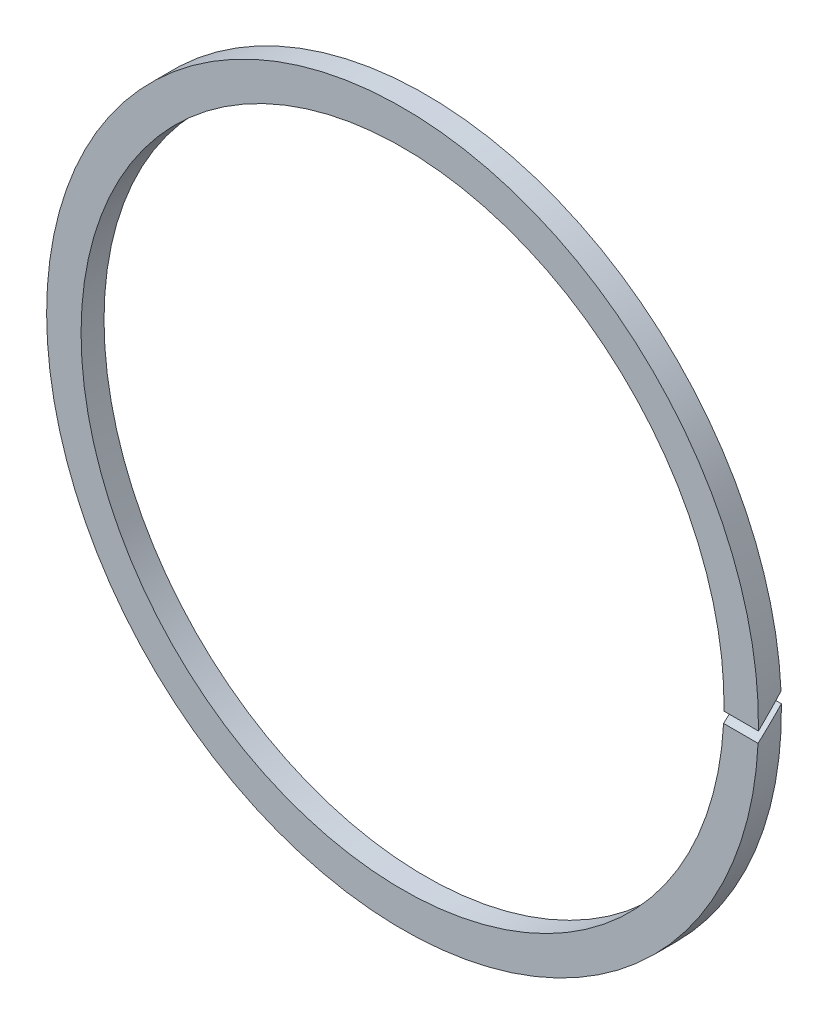
ISO-10303-21;
HEADER;
FILE_DESCRIPTION(('STEP AP214'),'2;1');
FILE_NAME('part.step','',(''),(''),'','','');
FILE_SCHEMA(('AUTOMOTIVE_DESIGN { 1 0 10303 214 1 1 1 1 }'));
ENDSEC;
DATA;
#1=APPLICATION_CONTEXT('core data for automotive mechanical design processes');
#2=APPLICATION_PROTOCOL_DEFINITION('international standard','automotive_design',2000,#1);
#3=PRODUCT_CONTEXT('',#1,'mechanical');
#4=PRODUCT('Part','Part','',(#3));
#5=PRODUCT_RELATED_PRODUCT_CATEGORY('part','',(#4));
#6=PRODUCT_DEFINITION_FORMATION('','',#4);
#7=PRODUCT_DEFINITION_CONTEXT('part definition',#1,'design');
#8=PRODUCT_DEFINITION('design','',#6,#7);
#9=PRODUCT_DEFINITION_SHAPE('','',#8);
#10=(LENGTH_UNIT() NAMED_UNIT(*) SI_UNIT(.MILLI.,.METRE.));
#11=(NAMED_UNIT(*) PLANE_ANGLE_UNIT() SI_UNIT($,.RADIAN.));
#12=(NAMED_UNIT(*) SI_UNIT($,.STERADIAN.) SOLID_ANGLE_UNIT());
#13=UNCERTAINTY_MEASURE_WITH_UNIT(LENGTH_MEASURE(1.E-05),#10,'distance_accuracy_value','');
#14=(GEOMETRIC_REPRESENTATION_CONTEXT(3) GLOBAL_UNCERTAINTY_ASSIGNED_CONTEXT((#13)) GLOBAL_UNIT_ASSIGNED_CONTEXT((#10,
#11,#12)) REPRESENTATION_CONTEXT('',''));
#15=CARTESIAN_POINT('',(0.,0.,0.));
#16=DIRECTION('',(0.,0.,1.));
#17=DIRECTION('',(1.,0.,0.));
#18=AXIS2_PLACEMENT_3D('',#15,#16,#17);
#19=CARTESIAN_POINT('',(8.32667268468867E-13,0.,3.));
#20=DIRECTION('',(0.,0.,0.999999999999988));
#21=DIRECTION('',(0.999999999999988,0.,0.));
#22=AXIS2_PLACEMENT_3D('',#19,#20,#21);
#23=PLANE('',#22);
#24=CARTESIAN_POINT('',(8.32667268468867E-13,0.,3.));
#25=DIRECTION('',(0.,0.,0.999999999999988));
#26=DIRECTION('',(0.999999999999988,0.,0.));
#27=AXIS2_PLACEMENT_3D('',#24,#25,#26);
#28=CIRCLE('',#27,46.5);
#29=CARTESIAN_POINT('',(46.4932469697316,-0.792455810579878,2.99999999999534));
#30=VERTEX_POINT('',#29);
#31=CARTESIAN_POINT('',(46.4476114593489,-2.206669372953,2.99999999999534));
#32=VERTEX_POINT('',#31);
#33=EDGE_CURVE('E85',#30,#32,#28,.T.);
#34=ORIENTED_EDGE('',*,*,#33,.T.);
#35=DIRECTION('',(-0.999999999999988,0.,0.));
#36=VECTOR('',#35,1.);
#37=CARTESIAN_POINT('',(8.32667268468867E-13,-2.20666937295383,3.));
#38=LINE('',#37,#36);
#39=CARTESIAN_POINT('',(41.9419910147173,-2.206669372953,2.99999999999534));
#40=VERTEX_POINT('',#39);
#41=EDGE_CURVE('E104',#32,#40,#38,.T.);
#42=ORIENTED_EDGE('',*,*,#41,.T.);
#43=CARTESIAN_POINT('',(8.32667268468867E-13,0.,3.));
#44=DIRECTION('',(0.,0.,0.999999999999988));
#45=DIRECTION('',(0.999999999999988,0.,0.));
#46=AXIS2_PLACEMENT_3D('',#43,#44,#45);
#47=CIRCLE('',#46,42.);
#48=CARTESIAN_POINT('',(41.9925233081847,-0.792455810579878,2.99999999999534));
#49=VERTEX_POINT('',#48);
#50=EDGE_CURVE('E97',#49,#40,#47,.T.);
#51=ORIENTED_EDGE('',*,*,#50,.F.);
#52=DIRECTION('',(0.999999999999988,0.,0.));
#53=VECTOR('',#52,1.);
#54=CARTESIAN_POINT('',(8.32667268468867E-13,-0.792455810580711,3.));
#55=LINE('',#54,#53);
#56=EDGE_CURVE('E61',#49,#30,#55,.T.);
#57=ORIENTED_EDGE('',*,*,#56,.T.);
#58=EDGE_LOOP('',(#34,#42,#51,#57));
#59=FACE_BOUND('',#58,.T.);
#60=ADVANCED_FACE('F38',(#59),#23,.T.);
#61=CARTESIAN_POINT('',(0.,0.,0.));
#62=DIRECTION('',(0.,0.,0.999999999999988));
#63=DIRECTION('',(0.999999999999988,0.,0.));
#64=AXIS2_PLACEMENT_3D('',#61,#62,#63);
#65=PLANE('',#64);
#66=DIRECTION('',(-0.999999999999988,0.,0.));
#67=VECTOR('',#66,1.);
#68=CARTESIAN_POINT('',(0.,0.793330627046229,0.));
#69=LINE('',#68,#67);
#70=CARTESIAN_POINT('',(46.4932320506576,0.793330627047034,-4.66293670342566E-12));
#71=VERTEX_POINT('',#70);
#72=CARTESIAN_POINT('',(41.9925067900963,0.793330627047034,-4.66293670342566E-12));
#73=VERTEX_POINT('',#72);
#74=EDGE_CURVE('E54',#71,#73,#69,.T.);
#75=ORIENTED_EDGE('',*,*,#74,.F.);
#76=CARTESIAN_POINT('',(0.,0.,0.));
#77=DIRECTION('',(0.,0.,0.999999999999988));
#78=DIRECTION('',(0.999999999999988,0.,0.));
#79=AXIS2_PLACEMENT_3D('',#76,#77,#78);
#80=CIRCLE('',#79,46.5);
#81=CARTESIAN_POINT('',(46.447569889627,2.20754418942015,-4.66293670342566E-12));
#82=VERTEX_POINT('',#81);
#83=EDGE_CURVE('E92',#82,#71,#80,.T.);
#84=ORIENTED_EDGE('',*,*,#83,.F.);
#85=DIRECTION('',(0.999999999999988,0.,0.));
#86=VECTOR('',#85,1.);
#87=CARTESIAN_POINT('',(-8.32667268468867E-13,2.20754418941932,0.));
#88=LINE('',#87,#86);
#89=CARTESIAN_POINT('',(41.9419449793614,2.20754418942015,-4.66293670342566E-12));
#90=VERTEX_POINT('',#89);
#91=EDGE_CURVE('E78',#90,#82,#88,.T.);
#92=ORIENTED_EDGE('',*,*,#91,.F.);
#93=CARTESIAN_POINT('',(0.,0.,0.));
#94=DIRECTION('',(0.,0.,0.999999999999988));
#95=DIRECTION('',(0.999999999999988,0.,0.));
#96=AXIS2_PLACEMENT_3D('',#93,#94,#95);
#97=CIRCLE('',#96,42.);
#98=EDGE_CURVE('E90',#90,#73,#97,.T.);
#99=ORIENTED_EDGE('',*,*,#98,.T.);
#100=EDGE_LOOP('',(#75,#84,#92,#99));
#101=FACE_BOUND('',#100,.T.);
#102=ADVANCED_FACE('F89',(#101),#65,.F.);
#103=CARTESIAN_POINT('',(8.32667268468867E-13,0.,3.));
#104=DIRECTION('',(0.,0.,-0.999999999999988));
#105=DIRECTION('',(-0.999999999999988,0.,0.));
#106=AXIS2_PLACEMENT_3D('',#103,#104,#105);
#107=CYLINDRICAL_SURFACE('',#106,46.5);
#108=CARTESIAN_POINT('',(0.,0.,0.793330627046229));
#109=DIRECTION('',(0.,0.707106781186543,0.707106781186532));
#110=DIRECTION('',(0.,0.707106781186552,-0.707106781186523));
#111=AXIS2_PLACEMENT_3D('',#108,#109,#110);
#112=ELLIPSE('',#111,65.7609306503485,46.5);
#113=EDGE_CURVE('E98',#32,#71,#112,.T.);
#114=ORIENTED_EDGE('',*,*,#113,.F.);
#115=ORIENTED_EDGE('',*,*,#33,.F.);
#116=CARTESIAN_POINT('',(8.32667268468867E-13,0.,2.20754418941932));
#117=DIRECTION('',(0.,-0.707106781186543,-0.707106781186532));
#118=DIRECTION('',(0.,0.707106781186552,-0.707106781186523));
#119=AXIS2_PLACEMENT_3D('',#116,#117,#118);
#120=ELLIPSE('',#119,65.7609306503485,46.5);
#121=EDGE_CURVE('E115',#82,#30,#120,.T.);
#122=ORIENTED_EDGE('',*,*,#121,.F.);
#123=ORIENTED_EDGE('',*,*,#83,.T.);
#124=EDGE_LOOP('',(#114,#115,#122,#123));
#125=FACE_BOUND('',#124,.T.);
#126=ADVANCED_FACE('F40',(#125),#107,.T.);
#127=CARTESIAN_POINT('',(8.32667268468867E-13,0.,3.));
#128=DIRECTION('',(0.,0.,-0.999999999999988));
#129=DIRECTION('',(-0.999999999999988,0.,0.));
#130=AXIS2_PLACEMENT_3D('',#127,#128,#129);
#131=CYLINDRICAL_SURFACE('',#130,42.);
#132=ORIENTED_EDGE('',*,*,#50,.T.);
#133=CARTESIAN_POINT('',(0.,0.,0.793330627046229));
#134=DIRECTION('',(0.,0.707106781186543,0.707106781186532));
#135=DIRECTION('',(0.,0.707106781186552,-0.707106781186523));
#136=AXIS2_PLACEMENT_3D('',#133,#134,#135);
#137=ELLIPSE('',#136,59.3969696196696,42.);
#138=EDGE_CURVE('E11',#40,#73,#137,.T.);
#139=ORIENTED_EDGE('',*,*,#138,.T.);
#140=ORIENTED_EDGE('',*,*,#98,.F.);
#141=CARTESIAN_POINT('',(8.32667268468867E-13,0.,2.20754418941932));
#142=DIRECTION('',(0.,-0.707106781186543,-0.707106781186532));
#143=DIRECTION('',(0.,0.707106781186552,-0.707106781186523));
#144=AXIS2_PLACEMENT_3D('',#141,#142,#143);
#145=ELLIPSE('',#144,59.3969696196696,42.);
#146=EDGE_CURVE('E47',#90,#49,#145,.T.);
#147=ORIENTED_EDGE('',*,*,#146,.T.);
#148=EDGE_LOOP('',(#132,#139,#140,#147));
#149=FACE_BOUND('',#148,.T.);
#150=ADVANCED_FACE('F95',(#149),#131,.F.);
#151=CARTESIAN_POINT('',(52.9999999999989,-11.3606096767729,13.5681538661872));
#152=DIRECTION('',(0.,-0.707106781186543,-0.707106781186532));
#153=DIRECTION('',(0.,0.707106781186552,-0.707106781186523));
#154=AXIS2_PLACEMENT_3D('',#151,#152,#153);
#155=PLANE('',#154);
#156=ORIENTED_EDGE('',*,*,#121,.T.);
#157=ORIENTED_EDGE('',*,*,#56,.F.);
#158=ORIENTED_EDGE('',*,*,#146,.F.);
#159=ORIENTED_EDGE('',*,*,#91,.T.);
#160=EDGE_LOOP('',(#156,#157,#158,#159));
#161=FACE_BOUND('',#160,.T.);
#162=ADVANCED_FACE('F77',(#161),#155,.T.);
#163=CARTESIAN_POINT('',(52.9999999999994,8.5662383717883,-7.77290774474487));
#164=DIRECTION('',(0.,0.707106781186543,0.707106781186532));
#165=DIRECTION('',(0.,-0.707106781186552,0.707106781186523));
#166=AXIS2_PLACEMENT_3D('',#163,#164,#165);
#167=PLANE('',#166);
#168=ORIENTED_EDGE('',*,*,#113,.T.);
#169=ORIENTED_EDGE('',*,*,#74,.T.);
#170=ORIENTED_EDGE('',*,*,#138,.F.);
#171=ORIENTED_EDGE('',*,*,#41,.F.);
#172=EDGE_LOOP('',(#168,#169,#170,#171));
#173=FACE_BOUND('',#172,.T.);
#174=ADVANCED_FACE('F128',(#173),#167,.T.);
#175=CLOSED_SHELL('',(#60,#102,#126,#150,#162,#174));
#176=MANIFOLD_SOLID_BREP('B2',#175);
#177=ADVANCED_BREP_SHAPE_REPRESENTATION('',(#18,#176),#14);
#178=SHAPE_DEFINITION_REPRESENTATION(#9,#177);
ENDSEC;
END-ISO-10303-21;
